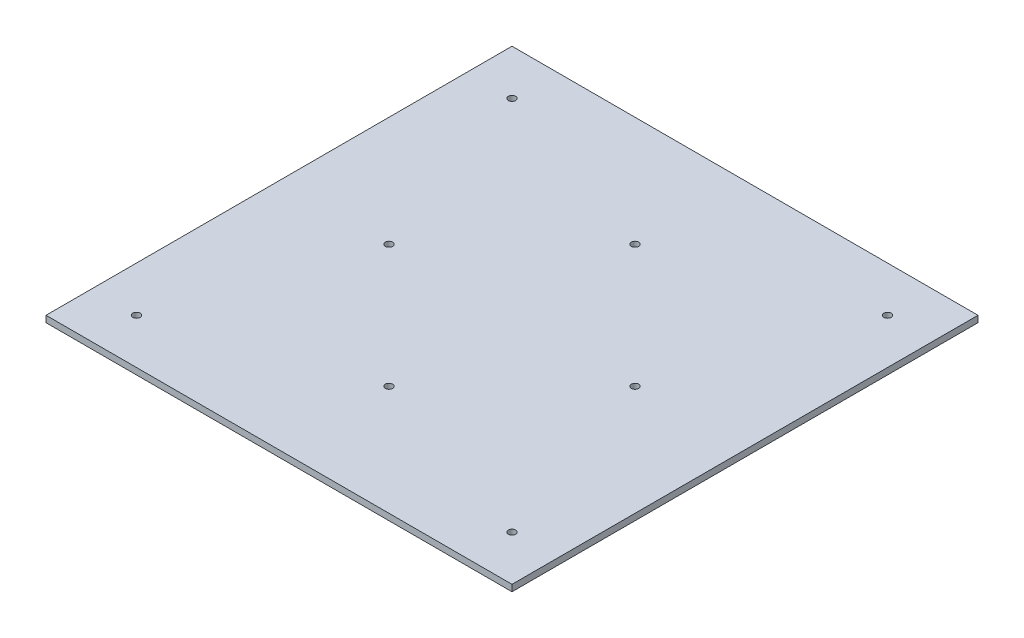
ISO-10303-21;
HEADER;
FILE_DESCRIPTION(('STEP AP214'),'2;1');
FILE_NAME('part.step','',(''),(''),'','','');
FILE_SCHEMA(('AUTOMOTIVE_DESIGN { 1 0 10303 214 1 1 1 1 }'));
ENDSEC;
DATA;
#1=APPLICATION_CONTEXT('core data for automotive mechanical design processes');
#2=APPLICATION_PROTOCOL_DEFINITION('international standard','automotive_design',2000,#1);
#3=PRODUCT_CONTEXT('',#1,'mechanical');
#4=PRODUCT('Part','Part','',(#3));
#5=PRODUCT_RELATED_PRODUCT_CATEGORY('part','',(#4));
#6=PRODUCT_DEFINITION_FORMATION('','',#4);
#7=PRODUCT_DEFINITION_CONTEXT('part definition',#1,'design');
#8=PRODUCT_DEFINITION('design','',#6,#7);
#9=PRODUCT_DEFINITION_SHAPE('','',#8);
#10=(LENGTH_UNIT() NAMED_UNIT(*) SI_UNIT(.MILLI.,.METRE.));
#11=(NAMED_UNIT(*) PLANE_ANGLE_UNIT() SI_UNIT($,.RADIAN.));
#12=(NAMED_UNIT(*) SI_UNIT($,.STERADIAN.) SOLID_ANGLE_UNIT());
#13=UNCERTAINTY_MEASURE_WITH_UNIT(LENGTH_MEASURE(1.E-05),#10,'distance_accuracy_value','');
#14=(GEOMETRIC_REPRESENTATION_CONTEXT(3) GLOBAL_UNCERTAINTY_ASSIGNED_CONTEXT((#13)) GLOBAL_UNIT_ASSIGNED_CONTEXT((#10,
#11,#12)) REPRESENTATION_CONTEXT('',''));
#15=CARTESIAN_POINT('',(0.,0.,0.));
#16=DIRECTION('',(0.,0.,1.));
#17=DIRECTION('',(1.,0.,0.));
#18=AXIS2_PLACEMENT_3D('',#15,#16,#17);
#19=CARTESIAN_POINT('',(107.95,1.5,107.95));
#20=DIRECTION('',(-1.,0.,0.));
#21=DIRECTION('',(0.,0.,1.));
#22=AXIS2_PLACEMENT_3D('',#19,#20,#21);
#23=PLANE('',#22);
#24=DIRECTION('',(0.,0.,-1.));
#25=VECTOR('',#24,1.);
#26=CARTESIAN_POINT('',(107.95,-1.5,107.95));
#27=LINE('',#26,#25);
#28=CARTESIAN_POINT('',(107.95,-1.5,107.95));
#29=VERTEX_POINT('',#28);
#30=CARTESIAN_POINT('',(107.95,-1.5,-107.95));
#31=VERTEX_POINT('',#30);
#32=EDGE_CURVE('E98',#29,#31,#27,.T.);
#33=ORIENTED_EDGE('',*,*,#32,.T.);
#34=DIRECTION('',(0.,-1.,0.));
#35=VECTOR('',#34,1.);
#36=CARTESIAN_POINT('',(107.95,1.5,-107.95));
#37=LINE('',#36,#35);
#38=CARTESIAN_POINT('',(107.95,1.5,-107.95));
#39=VERTEX_POINT('',#38);
#40=EDGE_CURVE('E11',#39,#31,#37,.T.);
#41=ORIENTED_EDGE('',*,*,#40,.F.);
#42=DIRECTION('',(0.,0.,-1.));
#43=VECTOR('',#42,1.);
#44=CARTESIAN_POINT('',(107.95,1.5,107.95));
#45=LINE('',#44,#43);
#46=CARTESIAN_POINT('',(107.95,1.5,107.95));
#47=VERTEX_POINT('',#46);
#48=EDGE_CURVE('E85',#47,#39,#45,.T.);
#49=ORIENTED_EDGE('',*,*,#48,.F.);
#50=DIRECTION('',(0.,-1.,0.));
#51=VECTOR('',#50,1.);
#52=CARTESIAN_POINT('',(107.95,1.5,107.95));
#53=LINE('',#52,#51);
#54=EDGE_CURVE('E94',#47,#29,#53,.T.);
#55=ORIENTED_EDGE('',*,*,#54,.T.);
#56=EDGE_LOOP('',(#33,#41,#49,#55));
#57=FACE_BOUND('',#56,.T.);
#58=ADVANCED_FACE('F32',(#57),#23,.F.);
#59=CARTESIAN_POINT('',(-107.95,1.5,-107.95));
#60=DIRECTION('',(0.,0.,1.));
#61=DIRECTION('',(1.,0.,0.));
#62=AXIS2_PLACEMENT_3D('',#59,#60,#61);
#63=PLANE('',#62);
#64=DIRECTION('',(-1.,0.,0.));
#65=VECTOR('',#64,1.);
#66=CARTESIAN_POINT('',(-107.95,-1.5,-107.95));
#67=LINE('',#66,#65);
#68=CARTESIAN_POINT('',(-107.95,-1.5,-107.95));
#69=VERTEX_POINT('',#68);
#70=EDGE_CURVE('E89',#31,#69,#67,.T.);
#71=ORIENTED_EDGE('',*,*,#70,.T.);
#72=DIRECTION('',(0.,-1.,0.));
#73=VECTOR('',#72,1.);
#74=CARTESIAN_POINT('',(-107.95,1.5,-107.95));
#75=LINE('',#74,#73);
#76=CARTESIAN_POINT('',(-107.95,1.5,-107.95));
#77=VERTEX_POINT('',#76);
#78=EDGE_CURVE('E41',#77,#69,#75,.T.);
#79=ORIENTED_EDGE('',*,*,#78,.F.);
#80=DIRECTION('',(-1.,0.,0.));
#81=VECTOR('',#80,1.);
#82=CARTESIAN_POINT('',(-107.95,1.5,-107.95));
#83=LINE('',#82,#81);
#84=EDGE_CURVE('E80',#39,#77,#83,.T.);
#85=ORIENTED_EDGE('',*,*,#84,.F.);
#86=ORIENTED_EDGE('',*,*,#40,.T.);
#87=EDGE_LOOP('',(#71,#79,#85,#86));
#88=FACE_BOUND('',#87,.T.);
#89=ADVANCED_FACE('F88',(#88),#63,.F.);
#90=CARTESIAN_POINT('',(-107.95,1.5,107.95));
#91=DIRECTION('',(1.,0.,0.));
#92=DIRECTION('',(0.,0.,-1.));
#93=AXIS2_PLACEMENT_3D('',#90,#91,#92);
#94=PLANE('',#93);
#95=DIRECTION('',(0.,0.,1.));
#96=VECTOR('',#95,1.);
#97=CARTESIAN_POINT('',(-107.95,-1.5,107.95));
#98=LINE('',#97,#96);
#99=CARTESIAN_POINT('',(-107.95,-1.5,107.95));
#100=VERTEX_POINT('',#99);
#101=EDGE_CURVE('E67',#69,#100,#98,.T.);
#102=ORIENTED_EDGE('',*,*,#101,.T.);
#103=DIRECTION('',(0.,-1.,0.));
#104=VECTOR('',#103,1.);
#105=CARTESIAN_POINT('',(-107.95,1.5,107.95));
#106=LINE('',#105,#104);
#107=CARTESIAN_POINT('',(-107.95,1.5,107.95));
#108=VERTEX_POINT('',#107);
#109=EDGE_CURVE('E90',#108,#100,#106,.T.);
#110=ORIENTED_EDGE('',*,*,#109,.F.);
#111=DIRECTION('',(0.,0.,1.));
#112=VECTOR('',#111,1.);
#113=CARTESIAN_POINT('',(-107.95,1.5,107.95));
#114=LINE('',#113,#112);
#115=EDGE_CURVE('E83',#77,#108,#114,.T.);
#116=ORIENTED_EDGE('',*,*,#115,.F.);
#117=ORIENTED_EDGE('',*,*,#78,.T.);
#118=EDGE_LOOP('',(#102,#110,#116,#117));
#119=FACE_BOUND('',#118,.T.);
#120=ADVANCED_FACE('F92',(#119),#94,.F.);
#121=CARTESIAN_POINT('',(-107.95,1.5,107.95));
#122=DIRECTION('',(0.,0.,-1.));
#123=DIRECTION('',(-1.,0.,0.));
#124=AXIS2_PLACEMENT_3D('',#121,#122,#123);
#125=PLANE('',#124);
#126=DIRECTION('',(1.,0.,0.));
#127=VECTOR('',#126,1.);
#128=CARTESIAN_POINT('',(-107.95,-1.5,107.95));
#129=LINE('',#128,#127);
#130=EDGE_CURVE('E73',#100,#29,#129,.T.);
#131=ORIENTED_EDGE('',*,*,#130,.T.);
#132=ORIENTED_EDGE('',*,*,#54,.F.);
#133=DIRECTION('',(1.,0.,0.));
#134=VECTOR('',#133,1.);
#135=CARTESIAN_POINT('',(-107.95,1.5,107.95));
#136=LINE('',#135,#134);
#137=EDGE_CURVE('E50',#108,#47,#136,.T.);
#138=ORIENTED_EDGE('',*,*,#137,.F.);
#139=ORIENTED_EDGE('',*,*,#109,.T.);
#140=EDGE_LOOP('',(#131,#132,#138,#139));
#141=FACE_BOUND('',#140,.T.);
#142=ADVANCED_FACE('F165',(#141),#125,.F.);
#143=CARTESIAN_POINT('',(0.,1.5,0.));
#144=DIRECTION('',(0.,-1.,0.));
#145=DIRECTION('',(0.,0.,-1.));
#146=AXIS2_PLACEMENT_3D('',#143,#144,#145);
#147=PLANE('',#146);
#148=CARTESIAN_POINT('',(-87.,1.5,-87.));
#149=DIRECTION('',(0.,1.,0.));
#150=DIRECTION('',(0.,0.,1.));
#151=AXIS2_PLACEMENT_3D('',#148,#149,#150);
#152=CIRCLE('',#151,1.69999999999999);
#153=CARTESIAN_POINT('',(-87.,1.5,-85.3));
#154=VERTEX_POINT('',#153);
#155=EDGE_CURVE('E139',#154,#154,#152,.T.);
#156=ORIENTED_EDGE('',*,*,#155,.F.);
#157=EDGE_LOOP('',(#156));
#158=FACE_BOUND('',#157,.T.);
#159=CARTESIAN_POINT('',(0.,1.5,-57.));
#160=DIRECTION('',(0.,1.,0.));
#161=DIRECTION('',(0.,0.,1.));
#162=AXIS2_PLACEMENT_3D('',#159,#160,#161);
#163=CIRCLE('',#162,1.7);
#164=CARTESIAN_POINT('',(0.,1.5,-55.3));
#165=VERTEX_POINT('',#164);
#166=EDGE_CURVE('E129',#165,#165,#163,.T.);
#167=ORIENTED_EDGE('',*,*,#166,.F.);
#168=EDGE_LOOP('',(#167));
#169=FACE_BOUND('',#168,.T.);
#170=CARTESIAN_POINT('',(87.,1.5,-87.));
#171=DIRECTION('',(0.,1.,0.));
#172=DIRECTION('',(0.,0.,1.));
#173=AXIS2_PLACEMENT_3D('',#170,#171,#172);
#174=CIRCLE('',#173,1.69999999999999);
#175=CARTESIAN_POINT('',(87.,1.5,-85.3));
#176=VERTEX_POINT('',#175);
#177=EDGE_CURVE('E126',#176,#176,#174,.T.);
#178=ORIENTED_EDGE('',*,*,#177,.F.);
#179=EDGE_LOOP('',(#178));
#180=FACE_BOUND('',#179,.T.);
#181=CARTESIAN_POINT('',(57.,1.5,0.));
#182=DIRECTION('',(0.,1.,0.));
#183=DIRECTION('',(0.,0.,1.));
#184=AXIS2_PLACEMENT_3D('',#181,#182,#183);
#185=CIRCLE('',#184,1.7);
#186=CARTESIAN_POINT('',(57.,1.5,1.7));
#187=VERTEX_POINT('',#186);
#188=EDGE_CURVE('E123',#187,#187,#185,.T.);
#189=ORIENTED_EDGE('',*,*,#188,.F.);
#190=EDGE_LOOP('',(#189));
#191=FACE_BOUND('',#190,.T.);
#192=CARTESIAN_POINT('',(87.,1.5,87.));
#193=DIRECTION('',(0.,1.,0.));
#194=DIRECTION('',(0.,0.,1.));
#195=AXIS2_PLACEMENT_3D('',#192,#193,#194);
#196=CIRCLE('',#195,1.69999999999999);
#197=CARTESIAN_POINT('',(87.,1.5,88.7));
#198=VERTEX_POINT('',#197);
#199=EDGE_CURVE('E119',#198,#198,#196,.T.);
#200=ORIENTED_EDGE('',*,*,#199,.F.);
#201=EDGE_LOOP('',(#200));
#202=FACE_BOUND('',#201,.T.);
#203=CARTESIAN_POINT('',(0.,1.5,57.));
#204=DIRECTION('',(0.,1.,0.));
#205=DIRECTION('',(0.,0.,1.));
#206=AXIS2_PLACEMENT_3D('',#203,#204,#205);
#207=CIRCLE('',#206,1.7);
#208=CARTESIAN_POINT('',(0.,1.5,58.7));
#209=VERTEX_POINT('',#208);
#210=EDGE_CURVE('E115',#209,#209,#207,.T.);
#211=ORIENTED_EDGE('',*,*,#210,.F.);
#212=EDGE_LOOP('',(#211));
#213=FACE_BOUND('',#212,.T.);
#214=CARTESIAN_POINT('',(-87.,1.5,87.));
#215=DIRECTION('',(0.,1.,0.));
#216=DIRECTION('',(0.,0.,1.));
#217=AXIS2_PLACEMENT_3D('',#214,#215,#216);
#218=CIRCLE('',#217,1.69999999999999);
#219=CARTESIAN_POINT('',(-87.,1.5,88.7));
#220=VERTEX_POINT('',#219);
#221=EDGE_CURVE('E111',#220,#220,#218,.T.);
#222=ORIENTED_EDGE('',*,*,#221,.F.);
#223=EDGE_LOOP('',(#222));
#224=FACE_BOUND('',#223,.T.);
#225=CARTESIAN_POINT('',(-57.,1.5,0.));
#226=DIRECTION('',(0.,1.,0.));
#227=DIRECTION('',(0.,0.,1.));
#228=AXIS2_PLACEMENT_3D('',#225,#226,#227);
#229=CIRCLE('',#228,1.7);
#230=CARTESIAN_POINT('',(-57.,1.5,1.7));
#231=VERTEX_POINT('',#230);
#232=EDGE_CURVE('E110',#231,#231,#229,.T.);
#233=ORIENTED_EDGE('',*,*,#232,.F.);
#234=EDGE_LOOP('',(#233));
#235=FACE_BOUND('',#234,.T.);
#236=ORIENTED_EDGE('',*,*,#48,.T.);
#237=ORIENTED_EDGE('',*,*,#84,.T.);
#238=ORIENTED_EDGE('',*,*,#115,.T.);
#239=ORIENTED_EDGE('',*,*,#137,.T.);
#240=EDGE_LOOP('',(#236,#237,#238,#239));
#241=FACE_BOUND('',#240,.T.);
#242=ADVANCED_FACE('F81',(#158,#169,#180,#191,#202,#213,#224,#235,#241),#147,.F.);
#243=CARTESIAN_POINT('',(0.,-1.5,0.));
#244=DIRECTION('',(0.,-1.,0.));
#245=DIRECTION('',(0.,0.,-1.));
#246=AXIS2_PLACEMENT_3D('',#243,#244,#245);
#247=PLANE('',#246);
#248=CARTESIAN_POINT('',(-87.,-1.5,-87.));
#249=DIRECTION('',(0.,-1.,0.));
#250=DIRECTION('',(0.,0.,-1.));
#251=AXIS2_PLACEMENT_3D('',#248,#249,#250);
#252=CIRCLE('',#251,1.69999999999999);
#253=CARTESIAN_POINT('',(-87.,-1.5,-88.7));
#254=VERTEX_POINT('',#253);
#255=EDGE_CURVE('E35',#254,#254,#252,.T.);
#256=ORIENTED_EDGE('',*,*,#255,.F.);
#257=EDGE_LOOP('',(#256));
#258=FACE_BOUND('',#257,.T.);
#259=CARTESIAN_POINT('',(0.,-1.5,-57.));
#260=DIRECTION('',(0.,-1.,0.));
#261=DIRECTION('',(0.,0.,-1.));
#262=AXIS2_PLACEMENT_3D('',#259,#260,#261);
#263=CIRCLE('',#262,1.7);
#264=CARTESIAN_POINT('',(0.,-1.5,-58.7));
#265=VERTEX_POINT('',#264);
#266=EDGE_CURVE('E127',#265,#265,#263,.T.);
#267=ORIENTED_EDGE('',*,*,#266,.F.);
#268=EDGE_LOOP('',(#267));
#269=FACE_BOUND('',#268,.T.);
#270=CARTESIAN_POINT('',(87.,-1.5,-87.));
#271=DIRECTION('',(0.,-1.,0.));
#272=DIRECTION('',(0.,0.,-1.));
#273=AXIS2_PLACEMENT_3D('',#270,#271,#272);
#274=CIRCLE('',#273,1.69999999999999);
#275=CARTESIAN_POINT('',(87.,-1.5,-88.7));
#276=VERTEX_POINT('',#275);
#277=EDGE_CURVE('E124',#276,#276,#274,.T.);
#278=ORIENTED_EDGE('',*,*,#277,.F.);
#279=EDGE_LOOP('',(#278));
#280=FACE_BOUND('',#279,.T.);
#281=CARTESIAN_POINT('',(57.,-1.5,0.));
#282=DIRECTION('',(0.,-1.,0.));
#283=DIRECTION('',(0.,0.,-1.));
#284=AXIS2_PLACEMENT_3D('',#281,#282,#283);
#285=CIRCLE('',#284,1.7);
#286=CARTESIAN_POINT('',(57.,-1.5,-1.7));
#287=VERTEX_POINT('',#286);
#288=EDGE_CURVE('E120',#287,#287,#285,.T.);
#289=ORIENTED_EDGE('',*,*,#288,.F.);
#290=EDGE_LOOP('',(#289));
#291=FACE_BOUND('',#290,.T.);
#292=CARTESIAN_POINT('',(87.,-1.5,87.));
#293=DIRECTION('',(0.,-1.,0.));
#294=DIRECTION('',(0.,0.,-1.));
#295=AXIS2_PLACEMENT_3D('',#292,#293,#294);
#296=CIRCLE('',#295,1.69999999999999);
#297=CARTESIAN_POINT('',(87.,-1.5,85.3));
#298=VERTEX_POINT('',#297);
#299=EDGE_CURVE('E116',#298,#298,#296,.T.);
#300=ORIENTED_EDGE('',*,*,#299,.F.);
#301=EDGE_LOOP('',(#300));
#302=FACE_BOUND('',#301,.T.);
#303=CARTESIAN_POINT('',(0.,-1.5,57.));
#304=DIRECTION('',(0.,-1.,0.));
#305=DIRECTION('',(0.,0.,-1.));
#306=AXIS2_PLACEMENT_3D('',#303,#304,#305);
#307=CIRCLE('',#306,1.7);
#308=CARTESIAN_POINT('',(0.,-1.5,55.3));
#309=VERTEX_POINT('',#308);
#310=EDGE_CURVE('E112',#309,#309,#307,.T.);
#311=ORIENTED_EDGE('',*,*,#310,.F.);
#312=EDGE_LOOP('',(#311));
#313=FACE_BOUND('',#312,.T.);
#314=CARTESIAN_POINT('',(-87.,-1.5,87.));
#315=DIRECTION('',(0.,-1.,0.));
#316=DIRECTION('',(0.,0.,-1.));
#317=AXIS2_PLACEMENT_3D('',#314,#315,#316);
#318=CIRCLE('',#317,1.69999999999999);
#319=CARTESIAN_POINT('',(-87.,-1.5,85.3));
#320=VERTEX_POINT('',#319);
#321=EDGE_CURVE('E107',#320,#320,#318,.T.);
#322=ORIENTED_EDGE('',*,*,#321,.F.);
#323=EDGE_LOOP('',(#322));
#324=FACE_BOUND('',#323,.T.);
#325=CARTESIAN_POINT('',(-57.,-1.5,0.));
#326=DIRECTION('',(0.,-1.,0.));
#327=DIRECTION('',(0.,0.,-1.));
#328=AXIS2_PLACEMENT_3D('',#325,#326,#327);
#329=CIRCLE('',#328,1.7);
#330=CARTESIAN_POINT('',(-57.,-1.5,-1.7));
#331=VERTEX_POINT('',#330);
#332=EDGE_CURVE('E101',#331,#331,#329,.T.);
#333=ORIENTED_EDGE('',*,*,#332,.F.);
#334=EDGE_LOOP('',(#333));
#335=FACE_BOUND('',#334,.T.);
#336=ORIENTED_EDGE('',*,*,#32,.F.);
#337=ORIENTED_EDGE('',*,*,#130,.F.);
#338=ORIENTED_EDGE('',*,*,#101,.F.);
#339=ORIENTED_EDGE('',*,*,#70,.F.);
#340=EDGE_LOOP('',(#336,#337,#338,#339));
#341=FACE_BOUND('',#340,.T.);
#342=ADVANCED_FACE('F158',(#258,#269,#280,#291,#302,#313,#324,#335,#341),#247,.T.);
#343=CARTESIAN_POINT('',(-57.,1.5,0.));
#344=DIRECTION('',(0.,1.,0.));
#345=DIRECTION('',(0.,0.,1.));
#346=AXIS2_PLACEMENT_3D('',#343,#344,#345);
#347=CYLINDRICAL_SURFACE('',#346,1.7);
#348=ORIENTED_EDGE('',*,*,#332,.T.);
#349=EDGE_LOOP('',(#348));
#350=FACE_BOUND('',#349,.T.);
#351=ORIENTED_EDGE('',*,*,#232,.T.);
#352=EDGE_LOOP('',(#351));
#353=FACE_BOUND('',#352,.T.);
#354=ADVANCED_FACE('F155',(#350,#353),#347,.F.);
#355=CARTESIAN_POINT('',(-87.,1.5,87.));
#356=DIRECTION('',(0.,1.,0.));
#357=DIRECTION('',(0.,0.,1.));
#358=AXIS2_PLACEMENT_3D('',#355,#356,#357);
#359=CYLINDRICAL_SURFACE('',#358,1.69999999999999);
#360=ORIENTED_EDGE('',*,*,#321,.T.);
#361=EDGE_LOOP('',(#360));
#362=FACE_BOUND('',#361,.T.);
#363=ORIENTED_EDGE('',*,*,#221,.T.);
#364=EDGE_LOOP('',(#363));
#365=FACE_BOUND('',#364,.T.);
#366=ADVANCED_FACE('F210',(#362,#365),#359,.F.);
#367=CARTESIAN_POINT('',(0.,1.5,57.));
#368=DIRECTION('',(0.,1.,0.));
#369=DIRECTION('',(0.,0.,1.));
#370=AXIS2_PLACEMENT_3D('',#367,#368,#369);
#371=CYLINDRICAL_SURFACE('',#370,1.7);
#372=ORIENTED_EDGE('',*,*,#310,.T.);
#373=EDGE_LOOP('',(#372));
#374=FACE_BOUND('',#373,.T.);
#375=ORIENTED_EDGE('',*,*,#210,.T.);
#376=EDGE_LOOP('',(#375));
#377=FACE_BOUND('',#376,.T.);
#378=ADVANCED_FACE('F219',(#374,#377),#371,.F.);
#379=CARTESIAN_POINT('',(87.,1.5,87.));
#380=DIRECTION('',(0.,1.,0.));
#381=DIRECTION('',(0.,0.,1.));
#382=AXIS2_PLACEMENT_3D('',#379,#380,#381);
#383=CYLINDRICAL_SURFACE('',#382,1.69999999999999);
#384=ORIENTED_EDGE('',*,*,#299,.T.);
#385=EDGE_LOOP('',(#384));
#386=FACE_BOUND('',#385,.T.);
#387=ORIENTED_EDGE('',*,*,#199,.T.);
#388=EDGE_LOOP('',(#387));
#389=FACE_BOUND('',#388,.T.);
#390=ADVANCED_FACE('F229',(#386,#389),#383,.F.);
#391=CARTESIAN_POINT('',(57.,1.5,0.));
#392=DIRECTION('',(0.,1.,0.));
#393=DIRECTION('',(0.,0.,1.));
#394=AXIS2_PLACEMENT_3D('',#391,#392,#393);
#395=CYLINDRICAL_SURFACE('',#394,1.7);
#396=ORIENTED_EDGE('',*,*,#288,.T.);
#397=EDGE_LOOP('',(#396));
#398=FACE_BOUND('',#397,.T.);
#399=ORIENTED_EDGE('',*,*,#188,.T.);
#400=EDGE_LOOP('',(#399));
#401=FACE_BOUND('',#400,.T.);
#402=ADVANCED_FACE('F239',(#398,#401),#395,.F.);
#403=CARTESIAN_POINT('',(87.,1.5,-87.));
#404=DIRECTION('',(0.,1.,0.));
#405=DIRECTION('',(0.,0.,1.));
#406=AXIS2_PLACEMENT_3D('',#403,#404,#405);
#407=CYLINDRICAL_SURFACE('',#406,1.69999999999999);
#408=ORIENTED_EDGE('',*,*,#277,.T.);
#409=EDGE_LOOP('',(#408));
#410=FACE_BOUND('',#409,.T.);
#411=ORIENTED_EDGE('',*,*,#177,.T.);
#412=EDGE_LOOP('',(#411));
#413=FACE_BOUND('',#412,.T.);
#414=ADVANCED_FACE('F249',(#410,#413),#407,.F.);
#415=CARTESIAN_POINT('',(0.,1.5,-57.));
#416=DIRECTION('',(0.,1.,0.));
#417=DIRECTION('',(0.,0.,1.));
#418=AXIS2_PLACEMENT_3D('',#415,#416,#417);
#419=CYLINDRICAL_SURFACE('',#418,1.7);
#420=ORIENTED_EDGE('',*,*,#266,.T.);
#421=EDGE_LOOP('',(#420));
#422=FACE_BOUND('',#421,.T.);
#423=ORIENTED_EDGE('',*,*,#166,.T.);
#424=EDGE_LOOP('',(#423));
#425=FACE_BOUND('',#424,.T.);
#426=ADVANCED_FACE('F259',(#422,#425),#419,.F.);
#427=CARTESIAN_POINT('',(-87.,1.5,-87.));
#428=DIRECTION('',(0.,1.,0.));
#429=DIRECTION('',(0.,0.,1.));
#430=AXIS2_PLACEMENT_3D('',#427,#428,#429);
#431=CYLINDRICAL_SURFACE('',#430,1.69999999999999);
#432=ORIENTED_EDGE('',*,*,#255,.T.);
#433=EDGE_LOOP('',(#432));
#434=FACE_BOUND('',#433,.T.);
#435=ORIENTED_EDGE('',*,*,#155,.T.);
#436=EDGE_LOOP('',(#435));
#437=FACE_BOUND('',#436,.T.);
#438=ADVANCED_FACE('F269',(#434,#437),#431,.F.);
#439=CLOSED_SHELL('',(#58,#89,#120,#142,#242,#342,#354,#366,#378,#390,#402,#414,#426,#438));
#440=MANIFOLD_SOLID_BREP('B2',#439);
#441=ADVANCED_BREP_SHAPE_REPRESENTATION('',(#18,#440),#14);
#442=SHAPE_DEFINITION_REPRESENTATION(#9,#441);
ENDSEC;
END-ISO-10303-21;
